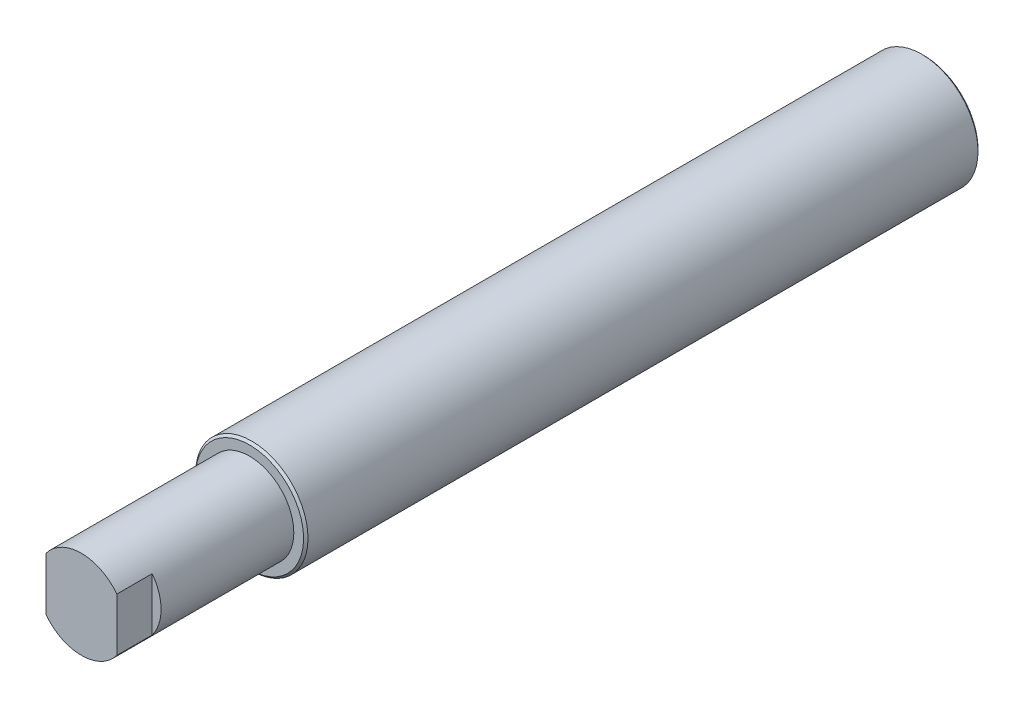
ISO-10303-21;
HEADER;
FILE_DESCRIPTION(('STEP AP214'),'2;1');
FILE_NAME('part.step','',(''),(''),'','','');
FILE_SCHEMA(('AUTOMOTIVE_DESIGN { 1 0 10303 214 1 1 1 1 }'));
ENDSEC;
DATA;
#1=APPLICATION_CONTEXT('core data for automotive mechanical design processes');
#2=APPLICATION_PROTOCOL_DEFINITION('international standard','automotive_design',2000,#1);
#3=PRODUCT_CONTEXT('',#1,'mechanical');
#4=PRODUCT('Part','Part','',(#3));
#5=PRODUCT_RELATED_PRODUCT_CATEGORY('part','',(#4));
#6=PRODUCT_DEFINITION_FORMATION('','',#4);
#7=PRODUCT_DEFINITION_CONTEXT('part definition',#1,'design');
#8=PRODUCT_DEFINITION('design','',#6,#7);
#9=PRODUCT_DEFINITION_SHAPE('','',#8);
#10=(LENGTH_UNIT() NAMED_UNIT(*) SI_UNIT(.MILLI.,.METRE.));
#11=(NAMED_UNIT(*) PLANE_ANGLE_UNIT() SI_UNIT($,.RADIAN.));
#12=(NAMED_UNIT(*) SI_UNIT($,.STERADIAN.) SOLID_ANGLE_UNIT());
#13=UNCERTAINTY_MEASURE_WITH_UNIT(LENGTH_MEASURE(1.E-05),#10,'distance_accuracy_value','');
#14=(GEOMETRIC_REPRESENTATION_CONTEXT(3) GLOBAL_UNCERTAINTY_ASSIGNED_CONTEXT((#13)) GLOBAL_UNIT_ASSIGNED_CONTEXT((#10,
#11,#12)) REPRESENTATION_CONTEXT('',''));
#15=CARTESIAN_POINT('',(0.,0.,0.));
#16=DIRECTION('',(0.,0.,1.));
#17=DIRECTION('',(1.,0.,0.));
#18=AXIS2_PLACEMENT_3D('',#15,#16,#17);
#19=CARTESIAN_POINT('',(0.,0.,-19.1));
#20=DIRECTION('',(0.,0.,-1.));
#21=DIRECTION('',(-1.,0.,0.));
#22=AXIS2_PLACEMENT_3D('',#19,#20,#21);
#23=CONICAL_SURFACE('',#22,1.42499999999999,1.02974425867665);
#24=CARTESIAN_POINT('',(0.,0.,-19.1));
#25=DIRECTION('',(0.,0.,-1.));
#26=DIRECTION('',(-1.,0.,0.));
#27=AXIS2_PLACEMENT_3D('',#24,#25,#26);
#28=CIRCLE('',#27,1.42499999999999);
#29=CARTESIAN_POINT('',(-1.42499999999999,0.,-19.1));
#30=VERTEX_POINT('',#29);
#31=EDGE_CURVE('E111',#30,#30,#28,.T.);
#32=ORIENTED_EDGE('',*,*,#31,.T.);
#33=EDGE_LOOP('',(#32));
#34=FACE_BOUND('',#33,.T.);
#35=CARTESIAN_POINT('',(0.,0.,-18.2437736178857));
#36=VERTEX_POINT('',#35);
#37=VERTEX_LOOP('',#36);
#38=FACE_BOUND('',#37,.T.);
#39=ADVANCED_FACE('F17',(#34,#38),#23,.F.);
#40=CARTESIAN_POINT('',(4.30840597163006,0.,53.1));
#41=DIRECTION('',(0.,0.,1.));
#42=DIRECTION('',(1.,0.,0.));
#43=AXIS2_PLACEMENT_3D('',#40,#41,#42);
#44=PLANE('',#43);
#45=DIRECTION('',(0.,1.,0.));
#46=VECTOR('',#45,1.);
#47=CARTESIAN_POINT('',(4.,2.99999999999999,53.1));
#48=LINE('',#47,#46);
#49=CARTESIAN_POINT('',(4.,2.99999999999998,53.1));
#50=VERTEX_POINT('',#49);
#51=CARTESIAN_POINT('',(4.,-2.99999999999998,53.1));
#52=VERTEX_POINT('',#51);
#53=EDGE_CURVE('E96',#50,#52,#48,.F.);
#54=ORIENTED_EDGE('',*,*,#53,.T.);
#55=CARTESIAN_POINT('',(0.,0.,53.1));
#56=DIRECTION('',(0.,0.,1.));
#57=DIRECTION('',(1.,0.,0.));
#58=AXIS2_PLACEMENT_3D('',#55,#56,#57);
#59=CIRCLE('',#58,4.99999999999999);
#60=EDGE_CURVE('E104',#50,#52,#59,.F.);
#61=ORIENTED_EDGE('',*,*,#60,.F.);
#62=EDGE_LOOP('',(#54,#61));
#63=FACE_BOUND('',#62,.T.);
#64=ADVANCED_FACE('F200',(#63),#44,.T.);
#65=CARTESIAN_POINT('',(4.,2.99999999999999,57.1));
#66=DIRECTION('',(-1.,0.,0.));
#67=DIRECTION('',(0.,0.,1.));
#68=AXIS2_PLACEMENT_3D('',#65,#66,#67);
#69=PLANE('',#68);
#70=DIRECTION('',(0.,0.,1.));
#71=VECTOR('',#70,1.);
#72=CARTESIAN_POINT('',(4.,2.99999999999999,38.1));
#73=LINE('',#72,#71);
#74=CARTESIAN_POINT('',(4.,2.99999999999998,57.1));
#75=VERTEX_POINT('',#74);
#76=EDGE_CURVE('E100',#75,#50,#73,.F.);
#77=ORIENTED_EDGE('',*,*,#76,.F.);
#78=DIRECTION('',(0.,1.,0.));
#79=VECTOR('',#78,1.);
#80=CARTESIAN_POINT('',(4.,0.,57.1));
#81=LINE('',#80,#79);
#82=CARTESIAN_POINT('',(4.,-2.99999999999998,57.1));
#83=VERTEX_POINT('',#82);
#84=EDGE_CURVE('E85',#75,#83,#81,.F.);
#85=ORIENTED_EDGE('',*,*,#84,.T.);
#86=DIRECTION('',(0.,0.,1.));
#87=VECTOR('',#86,1.);
#88=CARTESIAN_POINT('',(4.,-2.99999999999999,38.1));
#89=LINE('',#88,#87);
#90=EDGE_CURVE('E198',#52,#83,#89,.T.);
#91=ORIENTED_EDGE('',*,*,#90,.F.);
#92=ORIENTED_EDGE('',*,*,#53,.F.);
#93=EDGE_LOOP('',(#77,#85,#91,#92));
#94=FACE_BOUND('',#93,.T.);
#95=ADVANCED_FACE('F101',(#94),#69,.F.);
#96=CARTESIAN_POINT('',(0.,0.,57.1));
#97=DIRECTION('',(0.,0.,-1.));
#98=DIRECTION('',(-1.,0.,0.));
#99=AXIS2_PLACEMENT_3D('',#96,#97,#98);
#100=PLANE('',#99);
#101=CARTESIAN_POINT('',(0.,0.,57.1));
#102=DIRECTION('',(0.,0.,1.));
#103=DIRECTION('',(1.,0.,0.));
#104=AXIS2_PLACEMENT_3D('',#101,#102,#103);
#105=CIRCLE('',#104,4.99999999999999);
#106=CARTESIAN_POINT('',(-4.,-2.99999999999998,57.1));
#107=VERTEX_POINT('',#106);
#108=EDGE_CURVE('E91',#83,#107,#105,.F.);
#109=ORIENTED_EDGE('',*,*,#108,.F.);
#110=ORIENTED_EDGE('',*,*,#84,.F.);
#111=CARTESIAN_POINT('',(0.,0.,57.1));
#112=DIRECTION('',(0.,0.,1.));
#113=DIRECTION('',(1.,0.,0.));
#114=AXIS2_PLACEMENT_3D('',#111,#112,#113);
#115=CIRCLE('',#114,4.99999999999999);
#116=CARTESIAN_POINT('',(-4.,2.99999999999998,57.1));
#117=VERTEX_POINT('',#116);
#118=EDGE_CURVE('E21',#117,#75,#115,.F.);
#119=ORIENTED_EDGE('',*,*,#118,.F.);
#120=DIRECTION('',(0.,1.,0.));
#121=VECTOR('',#120,1.);
#122=CARTESIAN_POINT('',(-4.,-2.99999999999999,57.1));
#123=LINE('',#122,#121);
#124=EDGE_CURVE('E95',#117,#107,#123,.F.);
#125=ORIENTED_EDGE('',*,*,#124,.T.);
#126=EDGE_LOOP('',(#109,#110,#119,#125));
#127=FACE_BOUND('',#126,.T.);
#128=ADVANCED_FACE('F87',(#127),#100,.F.);
#129=CARTESIAN_POINT('',(-4.,-2.99999999999999,57.1));
#130=DIRECTION('',(1.,0.,0.));
#131=DIRECTION('',(0.,0.,-1.));
#132=AXIS2_PLACEMENT_3D('',#129,#130,#131);
#133=PLANE('',#132);
#134=DIRECTION('',(0.,0.,1.));
#135=VECTOR('',#134,1.);
#136=CARTESIAN_POINT('',(-4.,-2.99999999999998,38.1));
#137=LINE('',#136,#135);
#138=CARTESIAN_POINT('',(-4.,-2.99999999999998,53.1));
#139=VERTEX_POINT('',#138);
#140=EDGE_CURVE('E195',#107,#139,#137,.F.);
#141=ORIENTED_EDGE('',*,*,#140,.F.);
#142=ORIENTED_EDGE('',*,*,#124,.F.);
#143=DIRECTION('',(0.,0.,1.));
#144=VECTOR('',#143,1.);
#145=CARTESIAN_POINT('',(-4.,2.99999999999999,38.1));
#146=LINE('',#145,#144);
#147=CARTESIAN_POINT('',(-4.,2.99999999999998,53.1));
#148=VERTEX_POINT('',#147);
#149=EDGE_CURVE('E110',#148,#117,#146,.T.);
#150=ORIENTED_EDGE('',*,*,#149,.F.);
#151=DIRECTION('',(0.,1.,0.));
#152=VECTOR('',#151,1.);
#153=CARTESIAN_POINT('',(-4.,0.,53.1));
#154=LINE('',#153,#152);
#155=EDGE_CURVE('E114',#139,#148,#154,.T.);
#156=ORIENTED_EDGE('',*,*,#155,.F.);
#157=EDGE_LOOP('',(#141,#142,#150,#156));
#158=FACE_BOUND('',#157,.T.);
#159=ADVANCED_FACE('F257',(#158),#133,.F.);
#160=CARTESIAN_POINT('',(-4.30840597163006,0.,53.1));
#161=DIRECTION('',(0.,0.,1.));
#162=DIRECTION('',(1.,0.,0.));
#163=AXIS2_PLACEMENT_3D('',#160,#161,#162);
#164=PLANE('',#163);
#165=ORIENTED_EDGE('',*,*,#155,.T.);
#166=CARTESIAN_POINT('',(0.,0.,53.1));
#167=DIRECTION('',(0.,0.,1.));
#168=DIRECTION('',(1.,0.,0.));
#169=AXIS2_PLACEMENT_3D('',#166,#167,#168);
#170=CIRCLE('',#169,4.99999999999999);
#171=EDGE_CURVE('E192',#139,#148,#170,.F.);
#172=ORIENTED_EDGE('',*,*,#171,.F.);
#173=EDGE_LOOP('',(#165,#172));
#174=FACE_BOUND('',#173,.T.);
#175=ADVANCED_FACE('F254',(#174),#164,.T.);
#176=CARTESIAN_POINT('',(0.,0.,-37.85));
#177=DIRECTION('',(0.,0.,1.));
#178=DIRECTION('',(1.,0.,0.));
#179=AXIS2_PLACEMENT_3D('',#176,#177,#178);
#180=CYLINDRICAL_SURFACE('',#179,1.42499999999999);
#181=ORIENTED_EDGE('',*,*,#31,.F.);
#182=EDGE_LOOP('',(#181));
#183=FACE_BOUND('',#182,.T.);
#184=CARTESIAN_POINT('',(0.,0.,-37.849999999878));
#185=DIRECTION('',(0.,0.,-1.));
#186=DIRECTION('',(1.,0.,0.));
#187=AXIS2_PLACEMENT_3D('',#184,#185,#186);
#188=CIRCLE('',#187,1.42500000009704);
#189=CARTESIAN_POINT('',(1.42500000009704,0.,-37.849999999878));
#190=VERTEX_POINT('',#189);
#191=EDGE_CURVE('E189',#190,#190,#188,.T.);
#192=ORIENTED_EDGE('',*,*,#191,.T.);
#193=EDGE_LOOP('',(#192));
#194=FACE_BOUND('',#193,.T.);
#195=ADVANCED_FACE('F19',(#183,#194),#180,.F.);
#196=CARTESIAN_POINT('',(0.,0.,38.1));
#197=DIRECTION('',(0.,0.,1.));
#198=DIRECTION('',(1.,0.,0.));
#199=AXIS2_PLACEMENT_3D('',#196,#197,#198);
#200=CYLINDRICAL_SURFACE('',#199,4.99999999999999);
#201=CARTESIAN_POINT('',(0.,0.,38.1));
#202=DIRECTION('',(0.,0.,1.));
#203=DIRECTION('',(1.,0.,0.));
#204=AXIS2_PLACEMENT_3D('',#201,#202,#203);
#205=CIRCLE('',#204,4.99999999999999);
#206=CARTESIAN_POINT('',(4.99999999999999,0.,38.1));
#207=VERTEX_POINT('',#206);
#208=EDGE_CURVE('E188',#207,#207,#205,.T.);
#209=ORIENTED_EDGE('',*,*,#208,.T.);
#210=EDGE_LOOP('',(#209));
#211=FACE_BOUND('',#210,.T.);
#212=ORIENTED_EDGE('',*,*,#140,.T.);
#213=ORIENTED_EDGE('',*,*,#171,.T.);
#214=ORIENTED_EDGE('',*,*,#149,.T.);
#215=ORIENTED_EDGE('',*,*,#118,.T.);
#216=ORIENTED_EDGE('',*,*,#76,.T.);
#217=ORIENTED_EDGE('',*,*,#60,.T.);
#218=ORIENTED_EDGE('',*,*,#90,.T.);
#219=ORIENTED_EDGE('',*,*,#108,.T.);
#220=EDGE_LOOP('',(#212,#213,#214,#215,#216,#217,#218,#219));
#221=FACE_BOUND('',#220,.T.);
#222=ADVANCED_FACE('F107',(#211,#221),#200,.T.);
#223=CARTESIAN_POINT('',(0.,0.,-38.1000000000427));
#224=DIRECTION('',(0.,0.,-1.));
#225=DIRECTION('',(-1.,0.,0.));
#226=AXIS2_PLACEMENT_3D('',#223,#224,#225);
#227=CONICAL_SURFACE('',#226,1.67499999980691,0.785398162487954);
#228=CARTESIAN_POINT('',(0.,0.,-38.1000000001563));
#229=DIRECTION('',(0.,0.,-1.));
#230=DIRECTION('',(-1.,0.,0.));
#231=AXIS2_PLACEMENT_3D('',#228,#229,#230);
#232=CIRCLE('',#231,1.6749999999206);
#233=CARTESIAN_POINT('',(-1.6749999999206,0.,-38.1000000001563));
#234=VERTEX_POINT('',#233);
#235=EDGE_CURVE('E169',#234,#234,#232,.F.);
#236=ORIENTED_EDGE('',*,*,#235,.F.);
#237=EDGE_LOOP('',(#236));
#238=FACE_BOUND('',#237,.T.);
#239=ORIENTED_EDGE('',*,*,#191,.F.);
#240=EDGE_LOOP('',(#239));
#241=FACE_BOUND('',#240,.T.);
#242=ADVANCED_FACE('F239',(#238,#241),#227,.F.);
#243=CARTESIAN_POINT('',(0.,0.,38.1));
#244=DIRECTION('',(0.,0.,-1.));
#245=DIRECTION('',(-1.,0.,0.));
#246=AXIS2_PLACEMENT_3D('',#243,#244,#245);
#247=PLANE('',#246);
#248=ORIENTED_EDGE('',*,*,#208,.F.);
#249=EDGE_LOOP('',(#248));
#250=FACE_BOUND('',#249,.T.);
#251=CARTESIAN_POINT('',(0.,0.,38.1000000000995));
#252=DIRECTION('',(0.,0.,-1.));
#253=DIRECTION('',(-1.,0.,0.));
#254=AXIS2_PLACEMENT_3D('',#251,#252,#253);
#255=CIRCLE('',#254,6.10000000017408);
#256=CARTESIAN_POINT('',(-6.10000000017408,0.,38.1000000000995));
#257=VERTEX_POINT('',#256);
#258=EDGE_CURVE('E157',#257,#257,#255,.T.);
#259=ORIENTED_EDGE('',*,*,#258,.F.);
#260=EDGE_LOOP('',(#259));
#261=FACE_BOUND('',#260,.T.);
#262=ADVANCED_FACE('F237',(#250,#261),#247,.F.);
#263=CARTESIAN_POINT('',(-6.35,-1.5875,-38.1));
#264=DIRECTION('',(0.,-1.,0.));
#265=DIRECTION('',(0.,0.,-1.));
#266=AXIS2_PLACEMENT_3D('',#263,#264,#265);
#267=PLANE('',#266);
#268=DIRECTION('',(0.,0.,1.));
#269=VECTOR('',#268,1.);
#270=CARTESIAN_POINT('',(-6.14836106210428,-1.5875,0.));
#271=LINE('',#270,#269);
#272=CARTESIAN_POINT('',(-6.14836106210428,-1.5875,26.9));
#273=VERTEX_POINT('',#272);
#274=CARTESIAN_POINT('',(-6.14836106205264,-1.5875,-37.8499999999594));
#275=VERTEX_POINT('',#274);
#276=EDGE_CURVE('E154',#273,#275,#271,.F.);
#277=ORIENTED_EDGE('',*,*,#276,.F.);
#278=DIRECTION('',(1.,0.,0.));
#279=VECTOR('',#278,1.);
#280=CARTESIAN_POINT('',(-6.35,-1.5875,26.9));
#281=LINE('',#280,#279);
#282=CARTESIAN_POINT('',(-4.7625,-1.5875,26.9));
#283=VERTEX_POINT('',#282);
#284=EDGE_CURVE('E186',#283,#273,#281,.F.);
#285=ORIENTED_EDGE('',*,*,#284,.F.);
#286=DIRECTION('',(0.,0.,-1.));
#287=VECTOR('',#286,1.);
#288=CARTESIAN_POINT('',(-4.7625,-1.5875,-5.14080519958748));
#289=LINE('',#288,#287);
#290=CARTESIAN_POINT('',(-4.7625,-1.5875,-38.1));
#291=VERTEX_POINT('',#290);
#292=EDGE_CURVE('E165',#283,#291,#289,.T.);
#293=ORIENTED_EDGE('',*,*,#292,.T.);
#294=DIRECTION('',(-1.,0.,0.));
#295=VECTOR('',#294,1.);
#296=CARTESIAN_POINT('',(0.,-1.5875,-38.1));
#297=LINE('',#296,#295);
#298=CARTESIAN_POINT('',(-5.88980846484889,-1.5875,-38.10000000006));
#299=VERTEX_POINT('',#298);
#300=EDGE_CURVE('E178',#299,#291,#297,.F.);
#301=ORIENTED_EDGE('',*,*,#300,.F.);
#302=CARTESIAN_POINT('',(-6.148361062001,-1.5875,-37.8499999999188));
#303=CARTESIAN_POINT('',(-6.10529805886979,-1.5875,-37.8916967582117));
#304=CARTESIAN_POINT('',(-6.06222050758911,-1.5875,-37.9333784706573));
#305=CARTESIAN_POINT('',(-5.97603630851784,-1.5875,-38.0167118040578));
#306=CARTESIAN_POINT('',(-5.93292966072711,-1.5875,-38.0583634250126));
#307=CARTESIAN_POINT('',(-5.88980846478678,-1.5875,-38.10000000012));
#308=B_SPLINE_CURVE_WITH_KNOTS('',3,(#302,#303,#304,#305,#306,#307),.UNSPECIFIED.,.F.,.F.,(4,2,
4),(0.,0.179825930250926,0.359651861382289),.UNSPECIFIED.);
#309=EDGE_CURVE('E183',#275,#299,#308,.T.);
#310=ORIENTED_EDGE('',*,*,#309,.F.);
#311=EDGE_LOOP('',(#277,#285,#293,#301,#310));
#312=FACE_BOUND('',#311,.T.);
#313=ADVANCED_FACE('F214',(#312),#267,.F.);
#314=CARTESIAN_POINT('',(0.,0.,-38.1));
#315=DIRECTION('',(0.,0.,-1.));
#316=DIRECTION('',(-1.,0.,0.));
#317=AXIS2_PLACEMENT_3D('',#314,#315,#316);
#318=PLANE('',#317);
#319=ORIENTED_EDGE('',*,*,#235,.T.);
#320=EDGE_LOOP('',(#319));
#321=FACE_BOUND('',#320,.T.);
#322=CARTESIAN_POINT('',(0.,0.,-38.1000000000995));
#323=DIRECTION('',(0.,0.,1.));
#324=DIRECTION('',(1.,0.,0.));
#325=AXIS2_PLACEMENT_3D('',#322,#323,#324);
#326=CIRCLE('',#325,6.10000000017408);
#327=CARTESIAN_POINT('',(-5.88980846485951,1.5875,-38.1000000000497));
#328=VERTEX_POINT('',#327);
#329=EDGE_CURVE('E156',#299,#328,#326,.T.);
#330=ORIENTED_EDGE('',*,*,#329,.F.);
#331=ORIENTED_EDGE('',*,*,#300,.T.);
#332=DIRECTION('',(0.,1.,0.));
#333=VECTOR('',#332,1.);
#334=CARTESIAN_POINT('',(-4.7625,0.,-38.1));
#335=LINE('',#334,#333);
#336=CARTESIAN_POINT('',(-4.7625,1.5875,-38.1));
#337=VERTEX_POINT('',#336);
#338=EDGE_CURVE('E168',#291,#337,#335,.T.);
#339=ORIENTED_EDGE('',*,*,#338,.T.);
#340=DIRECTION('',(-1.,0.,0.));
#341=VECTOR('',#340,1.);
#342=CARTESIAN_POINT('',(0.,1.5875,-38.1));
#343=LINE('',#342,#341);
#344=EDGE_CURVE('E176',#337,#328,#343,.T.);
#345=ORIENTED_EDGE('',*,*,#344,.T.);
#346=EDGE_LOOP('',(#330,#331,#339,#345));
#347=FACE_BOUND('',#346,.T.);
#348=ADVANCED_FACE('F245',(#321,#347),#318,.T.);
#349=CARTESIAN_POINT('',(-4.7625,0.,-5.14080519958748));
#350=DIRECTION('',(1.,0.,0.));
#351=DIRECTION('',(0.,0.,-1.));
#352=AXIS2_PLACEMENT_3D('',#349,#350,#351);
#353=PLANE('',#352);
#354=ORIENTED_EDGE('',*,*,#292,.F.);
#355=CARTESIAN_POINT('',(-4.7625,0.,26.9));
#356=DIRECTION('',(1.,0.,0.));
#357=DIRECTION('',(0.,0.,-1.));
#358=AXIS2_PLACEMENT_3D('',#355,#356,#357);
#359=CIRCLE('',#358,1.5875);
#360=CARTESIAN_POINT('',(-4.7625,1.5875,26.9));
#361=VERTEX_POINT('',#360);
#362=EDGE_CURVE('E123',#283,#361,#359,.F.);
#363=ORIENTED_EDGE('',*,*,#362,.T.);
#364=DIRECTION('',(0.,0.,1.));
#365=VECTOR('',#364,1.);
#366=CARTESIAN_POINT('',(-4.7625,1.5875,26.9));
#367=LINE('',#366,#365);
#368=EDGE_CURVE('E159',#361,#337,#367,.F.);
#369=ORIENTED_EDGE('',*,*,#368,.T.);
#370=ORIENTED_EDGE('',*,*,#338,.F.);
#371=EDGE_LOOP('',(#354,#363,#369,#370));
#372=FACE_BOUND('',#371,.T.);
#373=ADVANCED_FACE('F317',(#372),#353,.F.);
#374=CARTESIAN_POINT('',(0.,0.,37.8499999999349));
#375=DIRECTION('',(0.,0.,-1.));
#376=DIRECTION('',(-1.,0.,0.));
#377=AXIS2_PLACEMENT_3D('',#374,#375,#376);
#378=CONICAL_SURFACE('',#377,6.34999999988395,0.785398162487954);
#379=ORIENTED_EDGE('',*,*,#258,.T.);
#380=EDGE_LOOP('',(#379));
#381=FACE_BOUND('',#380,.T.);
#382=CARTESIAN_POINT('',(0.,0.,37.85));
#383=DIRECTION('',(0.,0.,1.));
#384=DIRECTION('',(1.,0.,0.));
#385=AXIS2_PLACEMENT_3D('',#382,#383,#384);
#386=CIRCLE('',#385,6.35);
#387=CARTESIAN_POINT('',(6.35,0.,37.85));
#388=VERTEX_POINT('',#387);
#389=EDGE_CURVE('E141',#388,#388,#386,.F.);
#390=ORIENTED_EDGE('',*,*,#389,.F.);
#391=EDGE_LOOP('',(#390));
#392=FACE_BOUND('',#391,.T.);
#393=ADVANCED_FACE('F222',(#381,#392),#378,.T.);
#394=CARTESIAN_POINT('',(0.,0.,-37.8499999999349));
#395=DIRECTION('',(0.,0.,1.));
#396=DIRECTION('',(1.,0.,0.));
#397=AXIS2_PLACEMENT_3D('',#394,#395,#396);
#398=CONICAL_SURFACE('',#397,6.34999999988395,0.785398162487954);
#399=CARTESIAN_POINT('',(-5.88980846474306,1.58749999995006,-38.1000000001046));
#400=CARTESIAN_POINT('',(-5.93292966070241,1.58749999997503,-38.0583634250076));
#401=CARTESIAN_POINT('',(-5.97603630850736,1.58749999999168,-38.0167118040583));
#402=CARTESIAN_POINT('',(-6.06222050759744,1.58750000000832,-37.9333784706588));
#403=CARTESIAN_POINT('',(-6.10529805888272,1.58750000000832,-37.8916967582088));
#404=CARTESIAN_POINT('',(-6.14836106201373,1.5875,-37.8499999999065));
#405=B_SPLINE_CURVE_WITH_KNOTS('',3,(#399,#400,#401,#402,#403,#404),.UNSPECIFIED.,.F.,.F.,(4,2,
4),(0.,0.179825931150585,0.359651861420718),.UNSPECIFIED.);
#406=CARTESIAN_POINT('',(-6.148361062059,1.5875,-37.8499999999533));
#407=VERTEX_POINT('',#406);
#408=EDGE_CURVE('E162',#328,#407,#405,.T.);
#409=ORIENTED_EDGE('',*,*,#408,.T.);
#410=CARTESIAN_POINT('',(0.,0.,-37.85));
#411=DIRECTION('',(0.,0.,1.));
#412=DIRECTION('',(1.,0.,0.));
#413=AXIS2_PLACEMENT_3D('',#410,#411,#412);
#414=CIRCLE('',#413,6.35);
#415=EDGE_CURVE('E146',#275,#407,#414,.T.);
#416=ORIENTED_EDGE('',*,*,#415,.F.);
#417=ORIENTED_EDGE('',*,*,#309,.T.);
#418=ORIENTED_EDGE('',*,*,#329,.T.);
#419=EDGE_LOOP('',(#409,#416,#417,#418));
#420=FACE_BOUND('',#419,.T.);
#421=ADVANCED_FACE('F218',(#420),#398,.T.);
#422=CARTESIAN_POINT('',(-6.35,1.5875,26.9));
#423=DIRECTION('',(0.,1.,0.));
#424=DIRECTION('',(0.,0.,1.));
#425=AXIS2_PLACEMENT_3D('',#422,#423,#424);
#426=PLANE('',#425);
#427=ORIENTED_EDGE('',*,*,#344,.F.);
#428=ORIENTED_EDGE('',*,*,#368,.F.);
#429=DIRECTION('',(1.,0.,0.));
#430=VECTOR('',#429,1.);
#431=CARTESIAN_POINT('',(-6.35,1.58749999999999,26.9));
#432=LINE('',#431,#430);
#433=CARTESIAN_POINT('',(-6.14836106210428,1.58749999999999,26.9));
#434=VERTEX_POINT('',#433);
#435=EDGE_CURVE('E36',#361,#434,#432,.F.);
#436=ORIENTED_EDGE('',*,*,#435,.T.);
#437=DIRECTION('',(0.,0.,1.));
#438=VECTOR('',#437,1.);
#439=CARTESIAN_POINT('',(-6.14836106210428,1.5875,0.));
#440=LINE('',#439,#438);
#441=EDGE_CURVE('E27',#407,#434,#440,.T.);
#442=ORIENTED_EDGE('',*,*,#441,.F.);
#443=ORIENTED_EDGE('',*,*,#408,.F.);
#444=EDGE_LOOP('',(#427,#428,#436,#442,#443));
#445=FACE_BOUND('',#444,.T.);
#446=ADVANCED_FACE('F136',(#445),#426,.F.);
#447=CARTESIAN_POINT('',(-6.35,0.,26.9));
#448=DIRECTION('',(1.,0.,0.));
#449=DIRECTION('',(0.,0.,-1.));
#450=AXIS2_PLACEMENT_3D('',#447,#448,#449);
#451=CYLINDRICAL_SURFACE('',#450,1.5875);
#452=CARTESIAN_POINT('',(-6.14836106210428,1.58749999999999,26.9));
#453=CARTESIAN_POINT('',(-6.14835810868573,1.5875005347221,26.9439149519943));
#454=CARTESIAN_POINT('',(-6.14883215713891,1.58567661174545,26.9878081438792));
#455=CARTESIAN_POINT('',(-6.15070373440419,1.57840569717735,27.0752662599224));
#456=CARTESIAN_POINT('',(-6.15210110782842,1.57295931521448,27.1188312380687));
#457=CARTESIAN_POINT('',(-6.15762215250041,1.55126572658892,27.2483817698074));
#458=CARTESIAN_POINT('',(-6.16307509376748,1.52966372960039,27.333477074072));
#459=CARTESIAN_POINT('',(-6.17688995608207,1.47287895457942,27.4986868798194));
#460=CARTESIAN_POINT('',(-6.18525165274126,1.437697224097,27.5788017649419));
#461=CARTESIAN_POINT('',(-6.20393662510198,1.35479517756302,27.7320295247074));
#462=CARTESIAN_POINT('',(-6.21426035741522,1.30707194181755,27.8051407634689));
#463=CARTESIAN_POINT('',(-6.2359570788775,1.19933716705608,27.9438439347201));
#464=CARTESIAN_POINT('',(-6.24734667388769,1.1391030073315,28.009260299379));
#465=CARTESIAN_POINT('',(-6.26975132963679,1.00851371119876,28.1291937691142));
#466=CARTESIAN_POINT('',(-6.28076625476574,0.938154957437506,28.1837069619563));
#467=CARTESIAN_POINT('',(-6.30136714833112,0.788089535804089,28.2810081462468));
#468=CARTESIAN_POINT('',(-6.31093033514495,0.708263180753393,28.3236165956048));
#469=CARTESIAN_POINT('',(-6.32734283789912,0.542357177260222,28.3947003435318));
#470=CARTESIAN_POINT('',(-6.33419540463604,0.456285166695495,28.423192581835));
#471=CARTESIAN_POINT('',(-6.34280690605921,0.308152380307631,28.4585378606793));
#472=CARTESIAN_POINT('',(-6.34549035539136,0.247067257357052,28.4693799469506));
#473=CARTESIAN_POINT('',(-6.3490876888745,0.12399645441023,28.4838623085414));
#474=CARTESIAN_POINT('',(-6.35000159882553,0.0620107875572726,28.4875026888624));
#475=CARTESIAN_POINT('',(-6.34999773933436,-0.087680396748636,28.4874961980724));
#476=CARTESIAN_POINT('',(-6.34816513335973,-0.175411016460153,28.480208932828));
#477=CARTESIAN_POINT('',(-6.34102879138945,-0.348380525034637,28.4512871064531));
#478=CARTESIAN_POINT('',(-6.33572174751383,-0.433616958406108,28.4296388725301));
#479=CARTESIAN_POINT('',(-6.32222512421158,-0.599040292949523,28.3727341920645));
#480=CARTESIAN_POINT('',(-6.3140394800964,-0.679233912557768,28.3374963174863));
#481=CARTESIAN_POINT('',(-6.29565763049597,-0.832565934999532,28.2544718450794));
#482=CARTESIAN_POINT('',(-6.28546147615122,-0.905704517218626,28.2066855664289));
#483=CARTESIAN_POINT('',(-6.26393038121457,-1.04436365780342,28.0988805762075));
#484=CARTESIAN_POINT('',(-6.25257786624043,-1.10971829889362,28.0386519679792));
#485=CARTESIAN_POINT('',(-6.2301296384948,-1.22951519838159,27.9081157524361));
#486=CARTESIAN_POINT('',(-6.21903396685861,-1.2839557193555,27.8378065434363));
#487=CARTESIAN_POINT('',(-6.19817668389332,-1.38116725538388,27.6878082320332));
#488=CARTESIAN_POINT('',(-6.18843780250452,-1.42374920363026,27.6079932823966));
#489=CARTESIAN_POINT('',(-6.17166094046039,-1.49480507045921,27.4420731029571));
#490=CARTESIAN_POINT('',(-6.16462093284005,-1.52328958149317,27.3559726519095));
#491=CARTESIAN_POINT('',(-6.15576956135878,-1.55859647860433,27.2078419677354));
#492=CARTESIAN_POINT('',(-6.15300921691422,-1.56941841449221,27.1467921880725));
#493=CARTESIAN_POINT('',(-6.14929718216966,-1.58387467718142,27.0238392534877));
#494=CARTESIAN_POINT('',(-6.14834418929123,-1.58751418051884,26.9619367455719));
#495=CARTESIAN_POINT('',(-6.14836106210427,-1.58750000000001,26.9));
#496=B_SPLINE_CURVE_WITH_KNOTS('',3,(#452,#453,#454,#455,#456,#457,#458,#459,#460,#461,#462,
#463,#464,#465,#466,#467,#468,#469,#470,#471,#472,#473,#474,#475,#476,#477,#478,#479,#480,#481,
#482,#483,#484,#485,#486,#487,#488,#489,#490,#491,#492,#493,#494,#495),.UNSPECIFIED.,.F.,.F.,(4,
2,2,2,2,2,2,2,2,2,2,2,2,2,2,2,2,2,2,2,2,4),(0.,0.131661631551339,0.263301111190632,
0.52582756580209,0.788333772987207,1.05090114649685,1.31861744482507,1.58642963242962,
1.85808613315677,2.12941584627081,2.31528840630699,2.50115825628427,2.76396966106713,
3.02703164315822,3.28973538447957,3.55243244437768,3.81998818241834,4.08758647901981,
4.3592344386454,4.63067797793236,4.81644389573701,5.00207587901886),.UNSPECIFIED.);
#497=EDGE_CURVE('E11',#434,#273,#496,.T.);
#498=ORIENTED_EDGE('',*,*,#497,.F.);
#499=ORIENTED_EDGE('',*,*,#435,.F.);
#500=ORIENTED_EDGE('',*,*,#362,.F.);
#501=ORIENTED_EDGE('',*,*,#284,.T.);
#502=EDGE_LOOP('',(#498,#499,#500,#501));
#503=FACE_BOUND('',#502,.T.);
#504=ADVANCED_FACE('F125',(#503),#451,.F.);
#505=CARTESIAN_POINT('',(0.,0.,0.));
#506=DIRECTION('',(0.,0.,1.));
#507=DIRECTION('',(1.,0.,0.));
#508=AXIS2_PLACEMENT_3D('',#505,#506,#507);
#509=CYLINDRICAL_SURFACE('',#508,6.35);
#510=ORIENTED_EDGE('',*,*,#389,.T.);
#511=EDGE_LOOP('',(#510));
#512=FACE_BOUND('',#511,.T.);
#513=ORIENTED_EDGE('',*,*,#441,.T.);
#514=ORIENTED_EDGE('',*,*,#497,.T.);
#515=ORIENTED_EDGE('',*,*,#276,.T.);
#516=ORIENTED_EDGE('',*,*,#415,.T.);
#517=EDGE_LOOP('',(#513,#514,#515,#516));
#518=FACE_BOUND('',#517,.T.);
#519=ADVANCED_FACE('F128',(#512,#518),#509,.T.);
#520=CLOSED_SHELL('',(#39,#64,#95,#128,#159,#175,#195,#222,#242,#262,#313,#348,#373,#393,#421,
#446,#504,#519));
#521=MANIFOLD_SOLID_BREP('B1',#520);
#522=ADVANCED_BREP_SHAPE_REPRESENTATION('',(#18,#521),#14);
#523=SHAPE_DEFINITION_REPRESENTATION(#9,#522);
ENDSEC;
END-ISO-10303-21;
